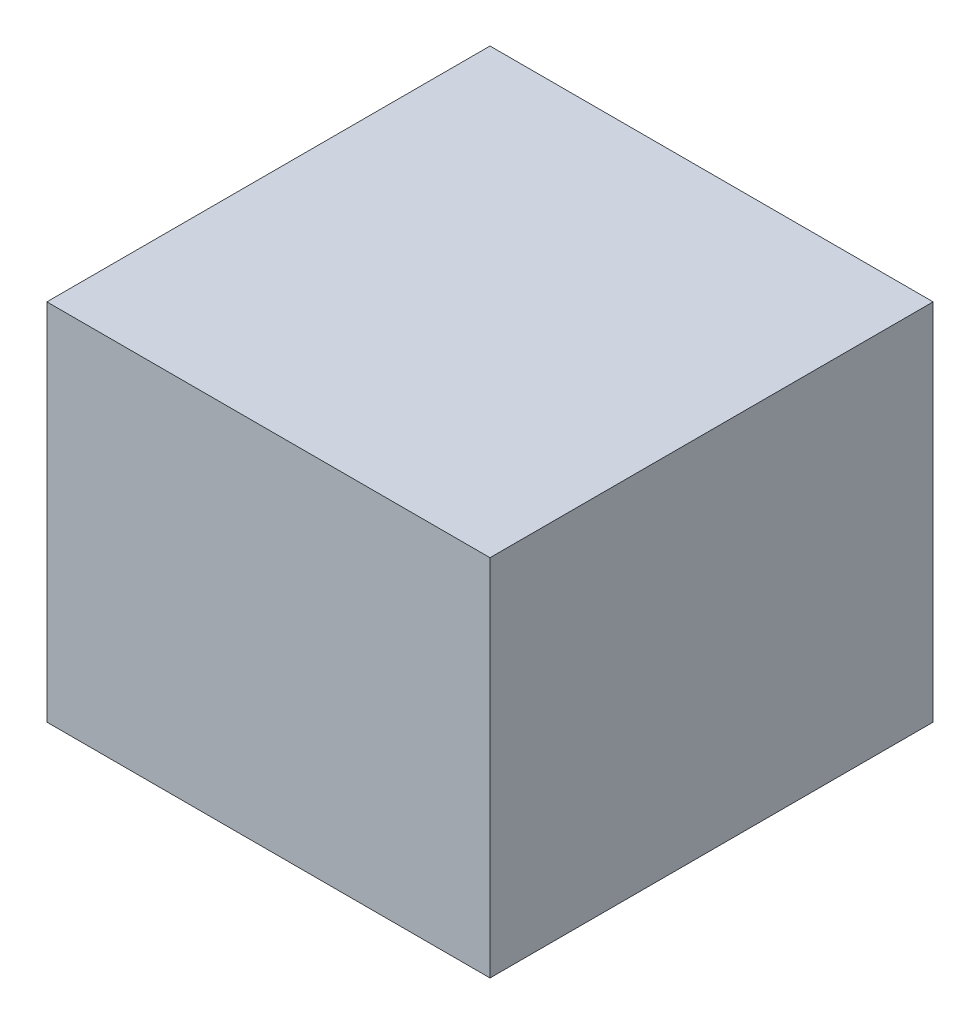
ISO-10303-21;
HEADER;
FILE_DESCRIPTION(('STEP AP214'),'2;1');
FILE_NAME('part.step','',(''),(''),'','','');
FILE_SCHEMA(('AUTOMOTIVE_DESIGN { 1 0 10303 214 1 1 1 1 }'));
ENDSEC;
DATA;
#1=APPLICATION_CONTEXT('core data for automotive mechanical design processes');
#2=APPLICATION_PROTOCOL_DEFINITION('international standard','automotive_design',2000,#1);
#3=PRODUCT_CONTEXT('',#1,'mechanical');
#4=PRODUCT('Part','Part','',(#3));
#5=PRODUCT_RELATED_PRODUCT_CATEGORY('part','',(#4));
#6=PRODUCT_DEFINITION_FORMATION('','',#4);
#7=PRODUCT_DEFINITION_CONTEXT('part definition',#1,'design');
#8=PRODUCT_DEFINITION('design','',#6,#7);
#9=PRODUCT_DEFINITION_SHAPE('','',#8);
#10=(LENGTH_UNIT() NAMED_UNIT(*) SI_UNIT(.MILLI.,.METRE.));
#11=(NAMED_UNIT(*) PLANE_ANGLE_UNIT() SI_UNIT($,.RADIAN.));
#12=(NAMED_UNIT(*) SI_UNIT($,.STERADIAN.) SOLID_ANGLE_UNIT());
#13=UNCERTAINTY_MEASURE_WITH_UNIT(LENGTH_MEASURE(1.E-05),#10,'distance_accuracy_value','');
#14=(GEOMETRIC_REPRESENTATION_CONTEXT(3) GLOBAL_UNCERTAINTY_ASSIGNED_CONTEXT((#13)) GLOBAL_UNIT_ASSIGNED_CONTEXT((#10,
#11,#12)) REPRESENTATION_CONTEXT('',''));
#15=CARTESIAN_POINT('',(0.,0.,0.));
#16=DIRECTION('',(0.,0.,1.));
#17=DIRECTION('',(1.,0.,0.));
#18=AXIS2_PLACEMENT_3D('',#15,#16,#17);
#19=CARTESIAN_POINT('',(0.,100.,0.));
#20=DIRECTION('',(0.,-1.,0.));
#21=DIRECTION('',(0.,0.,-1.));
#22=AXIS2_PLACEMENT_3D('',#19,#20,#21);
#23=CYLINDRICAL_SURFACE('',#22,16.);
#24=CARTESIAN_POINT('',(0.,53.,0.));
#25=DIRECTION('',(0.,1.,0.));
#26=DIRECTION('',(0.,0.,1.));
#27=AXIS2_PLACEMENT_3D('',#24,#25,#26);
#28=CIRCLE('',#27,16.);
#29=CARTESIAN_POINT('',(0.,53.,16.));
#30=VERTEX_POINT('',#29);
#31=EDGE_CURVE('E54',#30,#30,#28,.T.);
#32=ORIENTED_EDGE('',*,*,#31,.T.);
#33=EDGE_LOOP('',(#32));
#34=FACE_BOUND('',#33,.T.);
#35=CARTESIAN_POINT('',(0.,54.,0.));
#36=DIRECTION('',(0.,1.,0.));
#37=DIRECTION('',(0.,0.,1.));
#38=AXIS2_PLACEMENT_3D('',#35,#36,#37);
#39=CIRCLE('',#38,16.);
#40=CARTESIAN_POINT('',(0.,54.,16.));
#41=VERTEX_POINT('',#40);
#42=EDGE_CURVE('E11',#41,#41,#39,.T.);
#43=ORIENTED_EDGE('',*,*,#42,.F.);
#44=EDGE_LOOP('',(#43));
#45=FACE_BOUND('',#44,.T.);
#46=ADVANCED_FACE('F44',(#34,#45),#23,.T.);
#47=CARTESIAN_POINT('',(0.,100.,0.));
#48=DIRECTION('',(0.,-1.,0.));
#49=DIRECTION('',(0.,0.,-1.));
#50=AXIS2_PLACEMENT_3D('',#47,#48,#49);
#51=CYLINDRICAL_SURFACE('',#50,6.25);
#52=CARTESIAN_POINT('',(0.,53.,0.));
#53=DIRECTION('',(0.,1.,0.));
#54=DIRECTION('',(0.,0.,1.));
#55=AXIS2_PLACEMENT_3D('',#52,#53,#54);
#56=CIRCLE('',#55,6.25);
#57=CARTESIAN_POINT('',(0.,53.,6.25));
#58=VERTEX_POINT('',#57);
#59=EDGE_CURVE('E139',#58,#58,#56,.T.);
#60=ORIENTED_EDGE('',*,*,#59,.F.);
#61=EDGE_LOOP('',(#60));
#62=FACE_BOUND('',#61,.T.);
#63=CARTESIAN_POINT('',(0.,54.,0.));
#64=DIRECTION('',(0.,1.,0.));
#65=DIRECTION('',(0.,0.,1.));
#66=AXIS2_PLACEMENT_3D('',#63,#64,#65);
#67=CIRCLE('',#66,6.25);
#68=CARTESIAN_POINT('',(0.,54.,6.25));
#69=VERTEX_POINT('',#68);
#70=EDGE_CURVE('E48',#69,#69,#67,.T.);
#71=ORIENTED_EDGE('',*,*,#70,.T.);
#72=EDGE_LOOP('',(#71));
#73=FACE_BOUND('',#72,.T.);
#74=ADVANCED_FACE('F148',(#62,#73),#51,.F.);
#75=CARTESIAN_POINT('',(-20.,53.,-20.));
#76=DIRECTION('',(0.,1.,0.));
#77=DIRECTION('',(0.,0.,1.));
#78=AXIS2_PLACEMENT_3D('',#75,#76,#77);
#79=PLANE('',#78);
#80=ORIENTED_EDGE('',*,*,#59,.T.);
#81=EDGE_LOOP('',(#80));
#82=FACE_BOUND('',#81,.T.);
#83=ORIENTED_EDGE('',*,*,#31,.F.);
#84=EDGE_LOOP('',(#83));
#85=FACE_BOUND('',#84,.T.);
#86=ADVANCED_FACE('F151',(#82,#85),#79,.F.);
#87=CARTESIAN_POINT('',(-28.,54.,28.));
#88=DIRECTION('',(0.,1.,0.));
#89=DIRECTION('',(0.,0.,1.));
#90=AXIS2_PLACEMENT_3D('',#87,#88,#89);
#91=PLANE('',#90);
#92=ORIENTED_EDGE('',*,*,#70,.F.);
#93=EDGE_LOOP('',(#92));
#94=FACE_BOUND('',#93,.T.);
#95=ADVANCED_FACE('F146',(#94),#91,.F.);
#96=CARTESIAN_POINT('',(-28.,54.,28.));
#97=DIRECTION('',(1.,0.,0.));
#98=DIRECTION('',(0.,0.,-1.));
#99=AXIS2_PLACEMENT_3D('',#96,#97,#98);
#100=PLANE('',#99);
#101=DIRECTION('',(0.,-1.,0.));
#102=VECTOR('',#101,1.);
#103=CARTESIAN_POINT('',(-28.,54.,-28.));
#104=LINE('',#103,#102);
#105=CARTESIAN_POINT('',(-28.,100.,-28.));
#106=VERTEX_POINT('',#105);
#107=CARTESIAN_POINT('',(-28.,54.,-28.));
#108=VERTEX_POINT('',#107);
#109=EDGE_CURVE('E116',#106,#108,#104,.T.);
#110=ORIENTED_EDGE('',*,*,#109,.T.);
#111=DIRECTION('',(0.,0.,-1.));
#112=VECTOR('',#111,1.);
#113=CARTESIAN_POINT('',(-28.,54.,28.));
#114=LINE('',#113,#112);
#115=CARTESIAN_POINT('',(-28.,54.,28.));
#116=VERTEX_POINT('',#115);
#117=EDGE_CURVE('E107',#116,#108,#114,.T.);
#118=ORIENTED_EDGE('',*,*,#117,.F.);
#119=DIRECTION('',(0.,-1.,0.));
#120=VECTOR('',#119,1.);
#121=CARTESIAN_POINT('',(-28.,54.,28.));
#122=LINE('',#121,#120);
#123=CARTESIAN_POINT('',(-28.,100.,28.));
#124=VERTEX_POINT('',#123);
#125=EDGE_CURVE('E99',#124,#116,#122,.T.);
#126=ORIENTED_EDGE('',*,*,#125,.F.);
#127=DIRECTION('',(0.,0.,-1.));
#128=VECTOR('',#127,1.);
#129=CARTESIAN_POINT('',(-28.,100.,28.));
#130=LINE('',#129,#128);
#131=EDGE_CURVE('E113',#124,#106,#130,.T.);
#132=ORIENTED_EDGE('',*,*,#131,.T.);
#133=EDGE_LOOP('',(#110,#118,#126,#132));
#134=FACE_BOUND('',#133,.T.);
#135=ADVANCED_FACE('F147',(#134),#100,.F.);
#136=ORIENTED_EDGE('',*,*,#42,.T.);
#137=EDGE_LOOP('',(#136));
#138=FACE_BOUND('',#137,.T.);
#139=DIRECTION('',(1.,0.,0.));
#140=VECTOR('',#139,1.);
#141=CARTESIAN_POINT('',(-28.,54.,-28.));
#142=LINE('',#141,#140);
#143=CARTESIAN_POINT('',(28.,54.,-28.));
#144=VERTEX_POINT('',#143);
#145=EDGE_CURVE('E106',#108,#144,#142,.T.);
#146=ORIENTED_EDGE('',*,*,#145,.T.);
#147=DIRECTION('',(0.,0.,-1.));
#148=VECTOR('',#147,1.);
#149=CARTESIAN_POINT('',(28.,54.,28.));
#150=LINE('',#149,#148);
#151=CARTESIAN_POINT('',(28.,54.,28.));
#152=VERTEX_POINT('',#151);
#153=EDGE_CURVE('E102',#152,#144,#150,.T.);
#154=ORIENTED_EDGE('',*,*,#153,.F.);
#155=DIRECTION('',(1.,0.,0.));
#156=VECTOR('',#155,1.);
#157=CARTESIAN_POINT('',(-28.,54.,28.));
#158=LINE('',#157,#156);
#159=EDGE_CURVE('E92',#116,#152,#158,.T.);
#160=ORIENTED_EDGE('',*,*,#159,.F.);
#161=ORIENTED_EDGE('',*,*,#117,.T.);
#162=EDGE_LOOP('',(#146,#154,#160,#161));
#163=FACE_BOUND('',#162,.T.);
#164=ADVANCED_FACE('F104',(#138,#163),#91,.F.);
#165=CARTESIAN_POINT('',(28.,54.,28.));
#166=DIRECTION('',(-1.,0.,0.));
#167=DIRECTION('',(0.,0.,1.));
#168=AXIS2_PLACEMENT_3D('',#165,#166,#167);
#169=PLANE('',#168);
#170=DIRECTION('',(0.,1.,0.));
#171=VECTOR('',#170,1.);
#172=CARTESIAN_POINT('',(28.,54.,-28.));
#173=LINE('',#172,#171);
#174=CARTESIAN_POINT('',(28.,100.,-28.));
#175=VERTEX_POINT('',#174);
#176=EDGE_CURVE('E83',#144,#175,#173,.T.);
#177=ORIENTED_EDGE('',*,*,#176,.T.);
#178=DIRECTION('',(0.,0.,-1.));
#179=VECTOR('',#178,1.);
#180=CARTESIAN_POINT('',(28.,100.,28.));
#181=LINE('',#180,#179);
#182=CARTESIAN_POINT('',(28.,100.,28.));
#183=VERTEX_POINT('',#182);
#184=EDGE_CURVE('E108',#183,#175,#181,.T.);
#185=ORIENTED_EDGE('',*,*,#184,.F.);
#186=DIRECTION('',(0.,1.,0.));
#187=VECTOR('',#186,1.);
#188=CARTESIAN_POINT('',(28.,54.,28.));
#189=LINE('',#188,#187);
#190=EDGE_CURVE('E98',#152,#183,#189,.T.);
#191=ORIENTED_EDGE('',*,*,#190,.F.);
#192=ORIENTED_EDGE('',*,*,#153,.T.);
#193=EDGE_LOOP('',(#177,#185,#191,#192));
#194=FACE_BOUND('',#193,.T.);
#195=ADVANCED_FACE('F112',(#194),#169,.F.);
#196=CARTESIAN_POINT('',(0.,0.,28.));
#197=DIRECTION('',(0.,0.,-1.));
#198=DIRECTION('',(-1.,0.,0.));
#199=AXIS2_PLACEMENT_3D('',#196,#197,#198);
#200=PLANE('',#199);
#201=ORIENTED_EDGE('',*,*,#125,.T.);
#202=ORIENTED_EDGE('',*,*,#159,.T.);
#203=ORIENTED_EDGE('',*,*,#190,.T.);
#204=DIRECTION('',(-1.,0.,0.));
#205=VECTOR('',#204,1.);
#206=CARTESIAN_POINT('',(-28.,100.,28.));
#207=LINE('',#206,#205);
#208=EDGE_CURVE('E61',#183,#124,#207,.T.);
#209=ORIENTED_EDGE('',*,*,#208,.T.);
#210=EDGE_LOOP('',(#201,#202,#203,#209));
#211=FACE_BOUND('',#210,.T.);
#212=ADVANCED_FACE('F96',(#211),#200,.F.);
#213=CARTESIAN_POINT('',(0.,0.,-28.));
#214=DIRECTION('',(0.,0.,-1.));
#215=DIRECTION('',(-1.,0.,0.));
#216=AXIS2_PLACEMENT_3D('',#213,#214,#215);
#217=PLANE('',#216);
#218=ORIENTED_EDGE('',*,*,#109,.F.);
#219=DIRECTION('',(-1.,0.,0.));
#220=VECTOR('',#219,1.);
#221=CARTESIAN_POINT('',(-28.,100.,-28.));
#222=LINE('',#221,#220);
#223=EDGE_CURVE('E87',#175,#106,#222,.T.);
#224=ORIENTED_EDGE('',*,*,#223,.F.);
#225=ORIENTED_EDGE('',*,*,#176,.F.);
#226=ORIENTED_EDGE('',*,*,#145,.F.);
#227=EDGE_LOOP('',(#218,#224,#225,#226));
#228=FACE_BOUND('',#227,.T.);
#229=ADVANCED_FACE('F177',(#228),#217,.T.);
#230=CARTESIAN_POINT('',(0.,100.,0.));
#231=DIRECTION('',(0.,1.,0.));
#232=DIRECTION('',(0.,0.,1.));
#233=AXIS2_PLACEMENT_3D('',#230,#231,#232);
#234=PLANE('',#233);
#235=ORIENTED_EDGE('',*,*,#223,.T.);
#236=ORIENTED_EDGE('',*,*,#131,.F.);
#237=ORIENTED_EDGE('',*,*,#208,.F.);
#238=ORIENTED_EDGE('',*,*,#184,.T.);
#239=EDGE_LOOP('',(#235,#236,#237,#238));
#240=FACE_BOUND('',#239,.T.);
#241=ADVANCED_FACE('F178',(#240),#234,.T.);
#242=CLOSED_SHELL('',(#46,#74,#86,#95,#135,#164,#195,#212,#229,#241));
#243=MANIFOLD_SOLID_BREP('B2',#242);
#244=ADVANCED_BREP_SHAPE_REPRESENTATION('',(#18,#243),#14);
#245=SHAPE_DEFINITION_REPRESENTATION(#9,#244);
ENDSEC;
END-ISO-10303-21;
